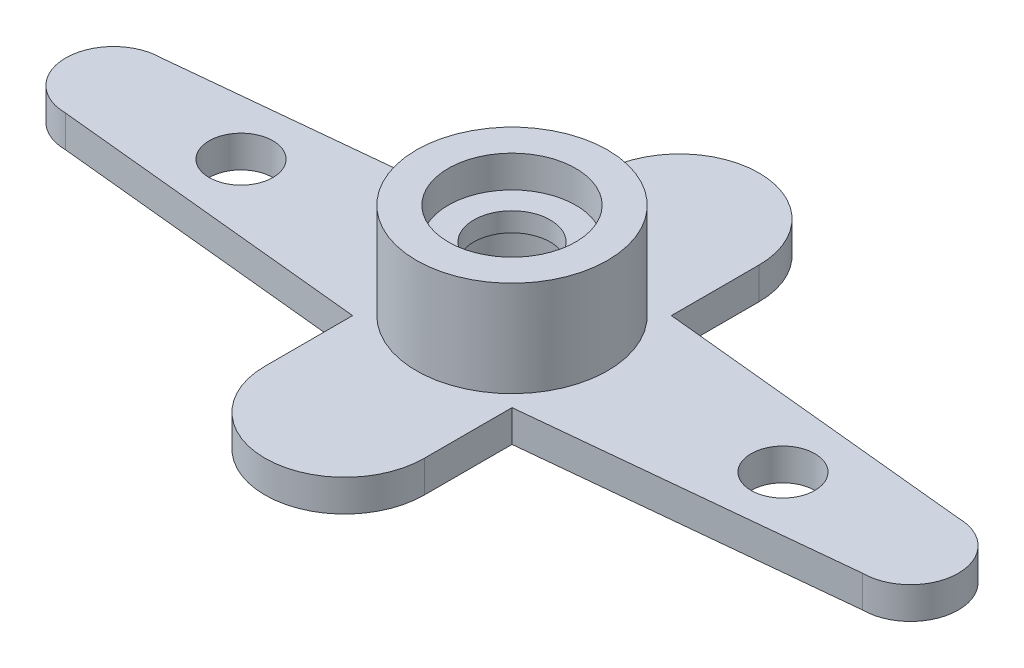
ISO-10303-21;
HEADER;
FILE_DESCRIPTION(('STEP AP214'),'2;1');
FILE_NAME('part.step','',(''),(''),'','','');
FILE_SCHEMA(('AUTOMOTIVE_DESIGN { 1 0 10303 214 1 1 1 1 }'));
ENDSEC;
DATA;
#1=APPLICATION_CONTEXT('core data for automotive mechanical design processes');
#2=APPLICATION_PROTOCOL_DEFINITION('international standard','automotive_design',2000,#1);
#3=PRODUCT_CONTEXT('',#1,'mechanical');
#4=PRODUCT('Part','Part','',(#3));
#5=PRODUCT_RELATED_PRODUCT_CATEGORY('part','',(#4));
#6=PRODUCT_DEFINITION_FORMATION('','',#4);
#7=PRODUCT_DEFINITION_CONTEXT('part definition',#1,'design');
#8=PRODUCT_DEFINITION('design','',#6,#7);
#9=PRODUCT_DEFINITION_SHAPE('','',#8);
#10=(LENGTH_UNIT() NAMED_UNIT(*) SI_UNIT(.MILLI.,.METRE.));
#11=(NAMED_UNIT(*) PLANE_ANGLE_UNIT() SI_UNIT($,.RADIAN.));
#12=(NAMED_UNIT(*) SI_UNIT($,.STERADIAN.) SOLID_ANGLE_UNIT());
#13=UNCERTAINTY_MEASURE_WITH_UNIT(LENGTH_MEASURE(1.E-05),#10,'distance_accuracy_value','');
#14=(GEOMETRIC_REPRESENTATION_CONTEXT(3) GLOBAL_UNCERTAINTY_ASSIGNED_CONTEXT((#13)) GLOBAL_UNIT_ASSIGNED_CONTEXT((#10,
#11,#12)) REPRESENTATION_CONTEXT('',''));
#15=CARTESIAN_POINT('',(0.,0.,0.));
#16=DIRECTION('',(0.,0.,1.));
#17=DIRECTION('',(1.,0.,0.));
#18=AXIS2_PLACEMENT_3D('',#15,#16,#17);
#19=CARTESIAN_POINT('',(0.,2.5,0.));
#20=DIRECTION('',(0.,-1.,0.));
#21=DIRECTION('',(0.,0.,-1.));
#22=AXIS2_PLACEMENT_3D('',#19,#20,#21);
#23=CYLINDRICAL_SURFACE('',#22,10.);
#24=CARTESIAN_POINT('',(0.,-2.5,0.));
#25=DIRECTION('',(0.,1.,0.));
#26=DIRECTION('',(0.,0.,1.));
#27=AXIS2_PLACEMENT_3D('',#24,#25,#26);
#28=CIRCLE('',#27,10.);
#29=CARTESIAN_POINT('',(0.,-2.5,10.));
#30=VERTEX_POINT('',#29);
#31=EDGE_CURVE('E163',#30,#30,#28,.T.);
#32=ORIENTED_EDGE('',*,*,#31,.F.);
#33=EDGE_LOOP('',(#32));
#34=FACE_BOUND('',#33,.T.);
#35=CARTESIAN_POINT('',(0.,9.5,0.));
#36=DIRECTION('',(0.,1.,0.));
#37=DIRECTION('',(0.,0.,1.));
#38=AXIS2_PLACEMENT_3D('',#35,#36,#37);
#39=CIRCLE('',#38,10.);
#40=CARTESIAN_POINT('',(0.,9.5,10.));
#41=VERTEX_POINT('',#40);
#42=EDGE_CURVE('E319',#41,#41,#39,.T.);
#43=ORIENTED_EDGE('',*,*,#42,.T.);
#44=EDGE_LOOP('',(#43));
#45=FACE_BOUND('',#44,.T.);
#46=ADVANCED_FACE('F36',(#34,#45),#23,.F.);
#47=CARTESIAN_POINT('',(62.5,2.5,0.));
#48=DIRECTION('',(0.,-1.,0.));
#49=DIRECTION('',(0.,0.,-1.));
#50=AXIS2_PLACEMENT_3D('',#47,#48,#49);
#51=PLANE('',#50);
#52=CARTESIAN_POINT('',(42.5,2.5,0.));
#53=DIRECTION('',(0.,1.,0.));
#54=DIRECTION('',(0.,0.,1.));
#55=AXIS2_PLACEMENT_3D('',#52,#53,#54);
#56=CIRCLE('',#55,5.);
#57=CARTESIAN_POINT('',(42.5,2.5,4.99999999999999));
#58=VERTEX_POINT('',#57);
#59=EDGE_CURVE('E322',#58,#58,#56,.T.);
#60=ORIENTED_EDGE('',*,*,#59,.F.);
#61=EDGE_LOOP('',(#60));
#62=FACE_BOUND('',#61,.T.);
#63=CARTESIAN_POINT('',(-42.5,2.5,0.));
#64=DIRECTION('',(0.,1.,0.));
#65=DIRECTION('',(0.,0.,1.));
#66=AXIS2_PLACEMENT_3D('',#63,#64,#65);
#67=CIRCLE('',#66,5.);
#68=CARTESIAN_POINT('',(-42.5,2.5,5.));
#69=VERTEX_POINT('',#68);
#70=EDGE_CURVE('E315',#69,#69,#67,.T.);
#71=ORIENTED_EDGE('',*,*,#70,.F.);
#72=EDGE_LOOP('',(#71));
#73=FACE_BOUND('',#72,.T.);
#74=DIRECTION('',(-0.995037190209989,0.,-0.099503719020999));
#75=VECTOR('',#74,1.);
#76=CARTESIAN_POINT('',(12.5,2.5,-12.5));
#77=LINE('',#76,#75);
#78=CARTESIAN_POINT('',(62.5,2.5,-7.5));
#79=VERTEX_POINT('',#78);
#80=CARTESIAN_POINT('',(12.5,2.5,-12.5));
#81=VERTEX_POINT('',#80);
#82=EDGE_CURVE('E182',#79,#81,#77,.T.);
#83=ORIENTED_EDGE('',*,*,#82,.T.);
#84=DIRECTION('',(0.,0.,-1.));
#85=VECTOR('',#84,1.);
#86=CARTESIAN_POINT('',(12.5,2.5,-12.5));
#87=LINE('',#86,#85);
#88=CARTESIAN_POINT('',(12.5,2.5,-26.25));
#89=VERTEX_POINT('',#88);
#90=EDGE_CURVE('E109',#81,#89,#87,.T.);
#91=ORIENTED_EDGE('',*,*,#90,.T.);
#92=CARTESIAN_POINT('',(0.,2.5,-26.25));
#93=DIRECTION('',(0.,1.,0.));
#94=DIRECTION('',(0.,0.,1.));
#95=AXIS2_PLACEMENT_3D('',#92,#93,#94);
#96=CIRCLE('',#95,12.5);
#97=CARTESIAN_POINT('',(-12.5,2.5,-26.25));
#98=VERTEX_POINT('',#97);
#99=EDGE_CURVE('E275',#89,#98,#96,.T.);
#100=ORIENTED_EDGE('',*,*,#99,.T.);
#101=DIRECTION('',(0.,0.,1.));
#102=VECTOR('',#101,1.);
#103=CARTESIAN_POINT('',(-12.5,2.5,-26.25));
#104=LINE('',#103,#102);
#105=CARTESIAN_POINT('',(-12.5,2.5,-12.5));
#106=VERTEX_POINT('',#105);
#107=EDGE_CURVE('E287',#98,#106,#104,.T.);
#108=ORIENTED_EDGE('',*,*,#107,.T.);
#109=DIRECTION('',(-0.995037190209989,0.,0.099503719020999));
#110=VECTOR('',#109,1.);
#111=CARTESIAN_POINT('',(-12.5,2.5,-12.5));
#112=LINE('',#111,#110);
#113=CARTESIAN_POINT('',(-62.5,2.5,-7.5));
#114=VERTEX_POINT('',#113);
#115=EDGE_CURVE('E284',#106,#114,#112,.T.);
#116=ORIENTED_EDGE('',*,*,#115,.T.);
#117=CARTESIAN_POINT('',(-62.5,2.5,0.));
#118=DIRECTION('',(0.,1.,0.));
#119=DIRECTION('',(0.,0.,-1.));
#120=AXIS2_PLACEMENT_3D('',#117,#118,#119);
#121=CIRCLE('',#120,7.5);
#122=CARTESIAN_POINT('',(-62.5,2.5,7.5));
#123=VERTEX_POINT('',#122);
#124=EDGE_CURVE('E286',#114,#123,#121,.T.);
#125=ORIENTED_EDGE('',*,*,#124,.T.);
#126=DIRECTION('',(0.995037190209989,0.,0.099503719020999));
#127=VECTOR('',#126,1.);
#128=CARTESIAN_POINT('',(-62.5,2.5,7.5));
#129=LINE('',#128,#127);
#130=CARTESIAN_POINT('',(-12.5,2.5,12.5));
#131=VERTEX_POINT('',#130);
#132=EDGE_CURVE('E289',#123,#131,#129,.T.);
#133=ORIENTED_EDGE('',*,*,#132,.T.);
#134=DIRECTION('',(0.,0.,1.));
#135=VECTOR('',#134,1.);
#136=CARTESIAN_POINT('',(-12.5,2.5,26.25));
#137=LINE('',#136,#135);
#138=CARTESIAN_POINT('',(-12.5,2.5,26.25));
#139=VERTEX_POINT('',#138);
#140=EDGE_CURVE('E295',#131,#139,#137,.T.);
#141=ORIENTED_EDGE('',*,*,#140,.T.);
#142=CARTESIAN_POINT('',(0.,2.5,26.25));
#143=DIRECTION('',(0.,1.,0.));
#144=DIRECTION('',(0.,0.,1.));
#145=AXIS2_PLACEMENT_3D('',#142,#143,#144);
#146=CIRCLE('',#145,12.5);
#147=CARTESIAN_POINT('',(12.5,2.5,26.25));
#148=VERTEX_POINT('',#147);
#149=EDGE_CURVE('E141',#139,#148,#146,.T.);
#150=ORIENTED_EDGE('',*,*,#149,.T.);
#151=DIRECTION('',(0.,0.,-1.));
#152=VECTOR('',#151,1.);
#153=CARTESIAN_POINT('',(12.5,2.5,12.5));
#154=LINE('',#153,#152);
#155=CARTESIAN_POINT('',(12.5,2.5,12.5));
#156=VERTEX_POINT('',#155);
#157=EDGE_CURVE('E134',#148,#156,#154,.T.);
#158=ORIENTED_EDGE('',*,*,#157,.T.);
#159=DIRECTION('',(0.995037190209989,0.,-0.099503719020999));
#160=VECTOR('',#159,1.);
#161=CARTESIAN_POINT('',(62.5,2.5,7.5));
#162=LINE('',#161,#160);
#163=CARTESIAN_POINT('',(62.5,2.5,7.5));
#164=VERTEX_POINT('',#163);
#165=EDGE_CURVE('E139',#156,#164,#162,.T.);
#166=ORIENTED_EDGE('',*,*,#165,.T.);
#167=CARTESIAN_POINT('',(62.5,2.5,0.));
#168=DIRECTION('',(0.,1.,0.));
#169=DIRECTION('',(0.,0.,-1.));
#170=AXIS2_PLACEMENT_3D('',#167,#168,#169);
#171=CIRCLE('',#170,7.5);
#172=EDGE_CURVE('E53',#164,#79,#171,.T.);
#173=ORIENTED_EDGE('',*,*,#172,.T.);
#174=EDGE_LOOP('',(#83,#91,#100,#108,#116,#125,#133,#141,#150,#158,#166,#173));
#175=FACE_BOUND('',#174,.T.);
#176=CARTESIAN_POINT('',(0.,2.5,0.));
#177=DIRECTION('',(0.,-1.,0.));
#178=DIRECTION('',(0.,0.,-1.));
#179=AXIS2_PLACEMENT_3D('',#176,#177,#178);
#180=CIRCLE('',#179,15.);
#181=CARTESIAN_POINT('',(0.,2.5,-15.));
#182=VERTEX_POINT('',#181);
#183=EDGE_CURVE('E45',#182,#182,#180,.F.);
#184=ORIENTED_EDGE('',*,*,#183,.F.);
#185=EDGE_LOOP('',(#184));
#186=FACE_BOUND('',#185,.T.);
#187=ADVANCED_FACE('F136',(#62,#73,#175,#186),#51,.F.);
#188=CARTESIAN_POINT('',(62.5,-2.5,0.));
#189=DIRECTION('',(0.,-1.,0.));
#190=DIRECTION('',(0.,0.,-1.));
#191=AXIS2_PLACEMENT_3D('',#188,#189,#190);
#192=PLANE('',#191);
#193=CARTESIAN_POINT('',(42.5,-2.5,0.));
#194=DIRECTION('',(0.,1.,0.));
#195=DIRECTION('',(0.,0.,1.));
#196=AXIS2_PLACEMENT_3D('',#193,#194,#195);
#197=CIRCLE('',#196,5.);
#198=CARTESIAN_POINT('',(42.5,-2.5,4.99999999999999));
#199=VERTEX_POINT('',#198);
#200=EDGE_CURVE('E314',#199,#199,#197,.T.);
#201=ORIENTED_EDGE('',*,*,#200,.T.);
#202=EDGE_LOOP('',(#201));
#203=FACE_BOUND('',#202,.T.);
#204=CARTESIAN_POINT('',(-42.5,-2.5,0.));
#205=DIRECTION('',(0.,1.,0.));
#206=DIRECTION('',(0.,0.,1.));
#207=AXIS2_PLACEMENT_3D('',#204,#205,#206);
#208=CIRCLE('',#207,5.);
#209=CARTESIAN_POINT('',(-42.5,-2.5,5.));
#210=VERTEX_POINT('',#209);
#211=EDGE_CURVE('E318',#210,#210,#208,.T.);
#212=ORIENTED_EDGE('',*,*,#211,.T.);
#213=EDGE_LOOP('',(#212));
#214=FACE_BOUND('',#213,.T.);
#215=DIRECTION('',(-0.995037190209989,0.,-0.099503719020999));
#216=VECTOR('',#215,1.);
#217=CARTESIAN_POINT('',(12.5,-2.5,-12.5));
#218=LINE('',#217,#216);
#219=CARTESIAN_POINT('',(62.5,-2.5,-7.5));
#220=VERTEX_POINT('',#219);
#221=CARTESIAN_POINT('',(12.5,-2.5,-12.5));
#222=VERTEX_POINT('',#221);
#223=EDGE_CURVE('E159',#220,#222,#218,.T.);
#224=ORIENTED_EDGE('',*,*,#223,.F.);
#225=CARTESIAN_POINT('',(62.5,-2.5,0.));
#226=DIRECTION('',(0.,1.,0.));
#227=DIRECTION('',(0.,0.,-1.));
#228=AXIS2_PLACEMENT_3D('',#225,#226,#227);
#229=CIRCLE('',#228,7.5);
#230=CARTESIAN_POINT('',(62.5,-2.5,7.5));
#231=VERTEX_POINT('',#230);
#232=EDGE_CURVE('E100',#231,#220,#229,.T.);
#233=ORIENTED_EDGE('',*,*,#232,.F.);
#234=DIRECTION('',(0.995037190209989,0.,-0.099503719020999));
#235=VECTOR('',#234,1.);
#236=CARTESIAN_POINT('',(62.5,-2.5,7.5));
#237=LINE('',#236,#235);
#238=CARTESIAN_POINT('',(12.5,-2.5,12.5));
#239=VERTEX_POINT('',#238);
#240=EDGE_CURVE('E94',#239,#231,#237,.T.);
#241=ORIENTED_EDGE('',*,*,#240,.F.);
#242=DIRECTION('',(0.,0.,-1.));
#243=VECTOR('',#242,1.);
#244=CARTESIAN_POINT('',(12.5,-2.5,12.5));
#245=LINE('',#244,#243);
#246=CARTESIAN_POINT('',(12.5,-2.5,26.25));
#247=VERTEX_POINT('',#246);
#248=EDGE_CURVE('E149',#247,#239,#245,.T.);
#249=ORIENTED_EDGE('',*,*,#248,.F.);
#250=CARTESIAN_POINT('',(0.,-2.5,26.25));
#251=DIRECTION('',(0.,1.,0.));
#252=DIRECTION('',(0.,0.,1.));
#253=AXIS2_PLACEMENT_3D('',#250,#251,#252);
#254=CIRCLE('',#253,12.5);
#255=CARTESIAN_POINT('',(-12.5,-2.5,26.25));
#256=VERTEX_POINT('',#255);
#257=EDGE_CURVE('E177',#256,#247,#254,.T.);
#258=ORIENTED_EDGE('',*,*,#257,.F.);
#259=DIRECTION('',(0.,0.,1.));
#260=VECTOR('',#259,1.);
#261=CARTESIAN_POINT('',(-12.5,-2.5,26.25));
#262=LINE('',#261,#260);
#263=CARTESIAN_POINT('',(-12.5,-2.5,12.5));
#264=VERTEX_POINT('',#263);
#265=EDGE_CURVE('E175',#264,#256,#262,.T.);
#266=ORIENTED_EDGE('',*,*,#265,.F.);
#267=DIRECTION('',(0.995037190209989,0.,0.099503719020999));
#268=VECTOR('',#267,1.);
#269=CARTESIAN_POINT('',(-62.5,-2.5,7.5));
#270=LINE('',#269,#268);
#271=CARTESIAN_POINT('',(-62.5,-2.5,7.5));
#272=VERTEX_POINT('',#271);
#273=EDGE_CURVE('E173',#272,#264,#270,.T.);
#274=ORIENTED_EDGE('',*,*,#273,.F.);
#275=CARTESIAN_POINT('',(-62.5,-2.5,0.));
#276=DIRECTION('',(0.,1.,0.));
#277=DIRECTION('',(0.,0.,-1.));
#278=AXIS2_PLACEMENT_3D('',#275,#276,#277);
#279=CIRCLE('',#278,7.5);
#280=CARTESIAN_POINT('',(-62.5,-2.5,-7.5));
#281=VERTEX_POINT('',#280);
#282=EDGE_CURVE('E171',#281,#272,#279,.T.);
#283=ORIENTED_EDGE('',*,*,#282,.F.);
#284=DIRECTION('',(-0.995037190209989,0.,0.099503719020999));
#285=VECTOR('',#284,1.);
#286=CARTESIAN_POINT('',(-12.5,-2.5,-12.5));
#287=LINE('',#286,#285);
#288=CARTESIAN_POINT('',(-12.5,-2.5,-12.5));
#289=VERTEX_POINT('',#288);
#290=EDGE_CURVE('E169',#289,#281,#287,.T.);
#291=ORIENTED_EDGE('',*,*,#290,.F.);
#292=DIRECTION('',(0.,0.,1.));
#293=VECTOR('',#292,1.);
#294=CARTESIAN_POINT('',(-12.5,-2.5,-26.25));
#295=LINE('',#294,#293);
#296=CARTESIAN_POINT('',(-12.5,-2.5,-26.25));
#297=VERTEX_POINT('',#296);
#298=EDGE_CURVE('E167',#297,#289,#295,.T.);
#299=ORIENTED_EDGE('',*,*,#298,.F.);
#300=CARTESIAN_POINT('',(0.,-2.5,-26.25));
#301=DIRECTION('',(0.,1.,0.));
#302=DIRECTION('',(0.,0.,1.));
#303=AXIS2_PLACEMENT_3D('',#300,#301,#302);
#304=CIRCLE('',#303,12.5);
#305=CARTESIAN_POINT('',(12.5,-2.5,-26.25));
#306=VERTEX_POINT('',#305);
#307=EDGE_CURVE('E165',#306,#297,#304,.T.);
#308=ORIENTED_EDGE('',*,*,#307,.F.);
#309=DIRECTION('',(0.,0.,-1.));
#310=VECTOR('',#309,1.);
#311=CARTESIAN_POINT('',(12.5,-2.5,-12.5));
#312=LINE('',#311,#310);
#313=EDGE_CURVE('E162',#222,#306,#312,.T.);
#314=ORIENTED_EDGE('',*,*,#313,.F.);
#315=EDGE_LOOP('',(#224,#233,#241,#249,#258,#266,#274,#283,#291,#299,#308,#314));
#316=FACE_BOUND('',#315,.T.);
#317=ORIENTED_EDGE('',*,*,#31,.T.);
#318=EDGE_LOOP('',(#317));
#319=FACE_BOUND('',#318,.T.);
#320=ADVANCED_FACE('F213',(#203,#214,#316,#319),#192,.T.);
#321=CARTESIAN_POINT('',(12.5,2.5,-12.5));
#322=DIRECTION('',(-0.099503719020999,0.,0.995037190209989));
#323=DIRECTION('',(0.995037190209989,0.,0.0995037190209991));
#324=AXIS2_PLACEMENT_3D('',#321,#322,#323);
#325=PLANE('',#324);
#326=ORIENTED_EDGE('',*,*,#223,.T.);
#327=DIRECTION('',(0.,-1.,0.));
#328=VECTOR('',#327,1.);
#329=CARTESIAN_POINT('',(12.5,2.5,-12.5));
#330=LINE('',#329,#328);
#331=EDGE_CURVE('E207',#81,#222,#330,.T.);
#332=ORIENTED_EDGE('',*,*,#331,.F.);
#333=ORIENTED_EDGE('',*,*,#82,.F.);
#334=DIRECTION('',(0.,-1.,0.));
#335=VECTOR('',#334,1.);
#336=CARTESIAN_POINT('',(62.5,2.5,-7.5));
#337=LINE('',#336,#335);
#338=EDGE_CURVE('E155',#79,#220,#337,.T.);
#339=ORIENTED_EDGE('',*,*,#338,.T.);
#340=EDGE_LOOP('',(#326,#332,#333,#339));
#341=FACE_BOUND('',#340,.T.);
#342=ADVANCED_FACE('F38',(#341),#325,.F.);
#343=CARTESIAN_POINT('',(12.5,2.5,-12.5));
#344=DIRECTION('',(-1.,0.,0.));
#345=DIRECTION('',(0.,0.,1.));
#346=AXIS2_PLACEMENT_3D('',#343,#344,#345);
#347=PLANE('',#346);
#348=ORIENTED_EDGE('',*,*,#313,.T.);
#349=DIRECTION('',(0.,-1.,0.));
#350=VECTOR('',#349,1.);
#351=CARTESIAN_POINT('',(12.5,2.5,-26.25));
#352=LINE('',#351,#350);
#353=EDGE_CURVE('E204',#89,#306,#352,.T.);
#354=ORIENTED_EDGE('',*,*,#353,.F.);
#355=ORIENTED_EDGE('',*,*,#90,.F.);
#356=ORIENTED_EDGE('',*,*,#331,.T.);
#357=EDGE_LOOP('',(#348,#354,#355,#356));
#358=FACE_BOUND('',#357,.T.);
#359=ADVANCED_FACE('F262',(#358),#347,.F.);
#360=CARTESIAN_POINT('',(0.,2.5,-26.25));
#361=DIRECTION('',(0.,-1.,0.));
#362=DIRECTION('',(0.,0.,-1.));
#363=AXIS2_PLACEMENT_3D('',#360,#361,#362);
#364=CYLINDRICAL_SURFACE('',#363,12.5);
#365=ORIENTED_EDGE('',*,*,#307,.T.);
#366=DIRECTION('',(0.,-1.,0.));
#367=VECTOR('',#366,1.);
#368=CARTESIAN_POINT('',(-12.5,2.5,-26.25));
#369=LINE('',#368,#367);
#370=EDGE_CURVE('E201',#98,#297,#369,.T.);
#371=ORIENTED_EDGE('',*,*,#370,.F.);
#372=ORIENTED_EDGE('',*,*,#99,.F.);
#373=ORIENTED_EDGE('',*,*,#353,.T.);
#374=EDGE_LOOP('',(#365,#371,#372,#373));
#375=FACE_BOUND('',#374,.T.);
#376=ADVANCED_FACE('F259',(#375),#364,.T.);
#377=CARTESIAN_POINT('',(-12.5,2.5,-26.25));
#378=DIRECTION('',(1.,0.,0.));
#379=DIRECTION('',(0.,0.,-1.));
#380=AXIS2_PLACEMENT_3D('',#377,#378,#379);
#381=PLANE('',#380);
#382=ORIENTED_EDGE('',*,*,#298,.T.);
#383=DIRECTION('',(0.,-1.,0.));
#384=VECTOR('',#383,1.);
#385=CARTESIAN_POINT('',(-12.5,2.5,-12.5));
#386=LINE('',#385,#384);
#387=EDGE_CURVE('E198',#106,#289,#386,.T.);
#388=ORIENTED_EDGE('',*,*,#387,.F.);
#389=ORIENTED_EDGE('',*,*,#107,.F.);
#390=ORIENTED_EDGE('',*,*,#370,.T.);
#391=EDGE_LOOP('',(#382,#388,#389,#390));
#392=FACE_BOUND('',#391,.T.);
#393=ADVANCED_FACE('F255',(#392),#381,.F.);
#394=CARTESIAN_POINT('',(-12.5,2.5,-12.5));
#395=DIRECTION('',(0.099503719020999,0.,0.995037190209989));
#396=DIRECTION('',(0.995037190209989,0.,-0.099503719020999));
#397=AXIS2_PLACEMENT_3D('',#394,#395,#396);
#398=PLANE('',#397);
#399=ORIENTED_EDGE('',*,*,#290,.T.);
#400=DIRECTION('',(0.,-1.,0.));
#401=VECTOR('',#400,1.);
#402=CARTESIAN_POINT('',(-62.5,2.5,-7.5));
#403=LINE('',#402,#401);
#404=EDGE_CURVE('E195',#114,#281,#403,.T.);
#405=ORIENTED_EDGE('',*,*,#404,.F.);
#406=ORIENTED_EDGE('',*,*,#115,.F.);
#407=ORIENTED_EDGE('',*,*,#387,.T.);
#408=EDGE_LOOP('',(#399,#405,#406,#407));
#409=FACE_BOUND('',#408,.T.);
#410=ADVANCED_FACE('F251',(#409),#398,.F.);
#411=CARTESIAN_POINT('',(-62.5,2.5,0.));
#412=DIRECTION('',(0.,-1.,0.));
#413=DIRECTION('',(0.,0.,-1.));
#414=AXIS2_PLACEMENT_3D('',#411,#412,#413);
#415=CYLINDRICAL_SURFACE('',#414,7.5);
#416=ORIENTED_EDGE('',*,*,#282,.T.);
#417=DIRECTION('',(0.,-1.,0.));
#418=VECTOR('',#417,1.);
#419=CARTESIAN_POINT('',(-62.5,2.5,7.5));
#420=LINE('',#419,#418);
#421=EDGE_CURVE('E192',#123,#272,#420,.T.);
#422=ORIENTED_EDGE('',*,*,#421,.F.);
#423=ORIENTED_EDGE('',*,*,#124,.F.);
#424=ORIENTED_EDGE('',*,*,#404,.T.);
#425=EDGE_LOOP('',(#416,#422,#423,#424));
#426=FACE_BOUND('',#425,.T.);
#427=ADVANCED_FACE('F247',(#426),#415,.T.);
#428=CARTESIAN_POINT('',(-62.5,2.5,7.5));
#429=DIRECTION('',(0.099503719020999,0.,-0.995037190209989));
#430=DIRECTION('',(-0.995037190209989,0.,-0.099503719020999));
#431=AXIS2_PLACEMENT_3D('',#428,#429,#430);
#432=PLANE('',#431);
#433=ORIENTED_EDGE('',*,*,#273,.T.);
#434=DIRECTION('',(0.,-1.,0.));
#435=VECTOR('',#434,1.);
#436=CARTESIAN_POINT('',(-12.5,2.5,12.5));
#437=LINE('',#436,#435);
#438=EDGE_CURVE('E189',#131,#264,#437,.T.);
#439=ORIENTED_EDGE('',*,*,#438,.F.);
#440=ORIENTED_EDGE('',*,*,#132,.F.);
#441=ORIENTED_EDGE('',*,*,#421,.T.);
#442=EDGE_LOOP('',(#433,#439,#440,#441));
#443=FACE_BOUND('',#442,.T.);
#444=ADVANCED_FACE('F243',(#443),#432,.F.);
#445=CARTESIAN_POINT('',(-12.5,2.5,26.25));
#446=DIRECTION('',(1.,0.,0.));
#447=DIRECTION('',(0.,0.,-1.));
#448=AXIS2_PLACEMENT_3D('',#445,#446,#447);
#449=PLANE('',#448);
#450=ORIENTED_EDGE('',*,*,#265,.T.);
#451=DIRECTION('',(0.,-1.,0.));
#452=VECTOR('',#451,1.);
#453=CARTESIAN_POINT('',(-12.5,2.5,26.25));
#454=LINE('',#453,#452);
#455=EDGE_CURVE('E186',#139,#256,#454,.T.);
#456=ORIENTED_EDGE('',*,*,#455,.F.);
#457=ORIENTED_EDGE('',*,*,#140,.F.);
#458=ORIENTED_EDGE('',*,*,#438,.T.);
#459=EDGE_LOOP('',(#450,#456,#457,#458));
#460=FACE_BOUND('',#459,.T.);
#461=ADVANCED_FACE('F239',(#460),#449,.F.);
#462=CARTESIAN_POINT('',(0.,2.5,26.25));
#463=DIRECTION('',(0.,-1.,0.));
#464=DIRECTION('',(0.,0.,-1.));
#465=AXIS2_PLACEMENT_3D('',#462,#463,#464);
#466=CYLINDRICAL_SURFACE('',#465,12.5);
#467=ORIENTED_EDGE('',*,*,#257,.T.);
#468=DIRECTION('',(0.,-1.,0.));
#469=VECTOR('',#468,1.);
#470=CARTESIAN_POINT('',(12.5,2.5,26.25));
#471=LINE('',#470,#469);
#472=EDGE_CURVE('E150',#148,#247,#471,.T.);
#473=ORIENTED_EDGE('',*,*,#472,.F.);
#474=ORIENTED_EDGE('',*,*,#149,.F.);
#475=ORIENTED_EDGE('',*,*,#455,.T.);
#476=EDGE_LOOP('',(#467,#473,#474,#475));
#477=FACE_BOUND('',#476,.T.);
#478=ADVANCED_FACE('F236',(#477),#466,.T.);
#479=CARTESIAN_POINT('',(12.5,2.5,12.5));
#480=DIRECTION('',(-1.,0.,0.));
#481=DIRECTION('',(0.,0.,1.));
#482=AXIS2_PLACEMENT_3D('',#479,#480,#481);
#483=PLANE('',#482);
#484=ORIENTED_EDGE('',*,*,#248,.T.);
#485=DIRECTION('',(0.,-1.,0.));
#486=VECTOR('',#485,1.);
#487=CARTESIAN_POINT('',(12.5,2.5,12.5));
#488=LINE('',#487,#486);
#489=EDGE_CURVE('E146',#156,#239,#488,.T.);
#490=ORIENTED_EDGE('',*,*,#489,.F.);
#491=ORIENTED_EDGE('',*,*,#157,.F.);
#492=ORIENTED_EDGE('',*,*,#472,.T.);
#493=EDGE_LOOP('',(#484,#490,#491,#492));
#494=FACE_BOUND('',#493,.T.);
#495=ADVANCED_FACE('F147',(#494),#483,.F.);
#496=CARTESIAN_POINT('',(62.5,2.5,7.5));
#497=DIRECTION('',(-0.099503719020999,0.,-0.995037190209989));
#498=DIRECTION('',(-0.995037190209989,0.,0.099503719020999));
#499=AXIS2_PLACEMENT_3D('',#496,#497,#498);
#500=PLANE('',#499);
#501=ORIENTED_EDGE('',*,*,#240,.T.);
#502=DIRECTION('',(0.,-1.,0.));
#503=VECTOR('',#502,1.);
#504=CARTESIAN_POINT('',(62.5,2.5,7.5));
#505=LINE('',#504,#503);
#506=EDGE_CURVE('E151',#164,#231,#505,.T.);
#507=ORIENTED_EDGE('',*,*,#506,.F.);
#508=ORIENTED_EDGE('',*,*,#165,.F.);
#509=ORIENTED_EDGE('',*,*,#489,.T.);
#510=EDGE_LOOP('',(#501,#507,#508,#509));
#511=FACE_BOUND('',#510,.T.);
#512=ADVANCED_FACE('F153',(#511),#500,.F.);
#513=CARTESIAN_POINT('',(62.5,2.5,0.));
#514=DIRECTION('',(0.,-1.,0.));
#515=DIRECTION('',(0.,0.,-1.));
#516=AXIS2_PLACEMENT_3D('',#513,#514,#515);
#517=CYLINDRICAL_SURFACE('',#516,7.5);
#518=ORIENTED_EDGE('',*,*,#232,.T.);
#519=ORIENTED_EDGE('',*,*,#338,.F.);
#520=ORIENTED_EDGE('',*,*,#172,.F.);
#521=ORIENTED_EDGE('',*,*,#506,.T.);
#522=EDGE_LOOP('',(#518,#519,#520,#521));
#523=FACE_BOUND('',#522,.T.);
#524=ADVANCED_FACE('F229',(#523),#517,.T.);
#525=CARTESIAN_POINT('',(0.,12.5,0.));
#526=DIRECTION('',(0.,1.,0.));
#527=DIRECTION('',(0.,0.,1.));
#528=AXIS2_PLACEMENT_3D('',#525,#526,#527);
#529=CIRCLE('',#528,10.);
#530=CARTESIAN_POINT('',(0.,12.5,10.));
#531=VERTEX_POINT('',#530);
#532=EDGE_CURVE('E11',#531,#531,#529,.T.);
#533=ORIENTED_EDGE('',*,*,#532,.F.);
#534=EDGE_LOOP('',(#533));
#535=FACE_BOUND('',#534,.T.);
#536=CARTESIAN_POINT('',(0.,17.5,0.));
#537=DIRECTION('',(0.,1.,0.));
#538=DIRECTION('',(0.,0.,1.));
#539=AXIS2_PLACEMENT_3D('',#536,#537,#538);
#540=CIRCLE('',#539,10.);
#541=CARTESIAN_POINT('',(0.,17.5,10.));
#542=VERTEX_POINT('',#541);
#543=EDGE_CURVE('E311',#542,#542,#540,.T.);
#544=ORIENTED_EDGE('',*,*,#543,.T.);
#545=EDGE_LOOP('',(#544));
#546=FACE_BOUND('',#545,.T.);
#547=ADVANCED_FACE('F224',(#535,#546),#23,.F.);
#548=CARTESIAN_POINT('',(0.,17.5,0.));
#549=DIRECTION('',(0.,1.,0.));
#550=DIRECTION('',(0.,0.,1.));
#551=AXIS2_PLACEMENT_3D('',#548,#549,#550);
#552=PLANE('',#551);
#553=CARTESIAN_POINT('',(0.,17.5,0.));
#554=DIRECTION('',(0.,1.,0.));
#555=DIRECTION('',(0.,0.,1.));
#556=AXIS2_PLACEMENT_3D('',#553,#554,#555);
#557=CIRCLE('',#556,15.);
#558=CARTESIAN_POINT('',(0.,17.5,15.));
#559=VERTEX_POINT('',#558);
#560=EDGE_CURVE('E308',#559,#559,#557,.T.);
#561=ORIENTED_EDGE('',*,*,#560,.T.);
#562=EDGE_LOOP('',(#561));
#563=FACE_BOUND('',#562,.T.);
#564=ORIENTED_EDGE('',*,*,#543,.F.);
#565=EDGE_LOOP('',(#564));
#566=FACE_BOUND('',#565,.T.);
#567=ADVANCED_FACE('F359',(#563,#566),#552,.T.);
#568=CARTESIAN_POINT('',(0.,17.5,0.));
#569=DIRECTION('',(0.,-1.,0.));
#570=DIRECTION('',(0.,0.,-1.));
#571=AXIS2_PLACEMENT_3D('',#568,#569,#570);
#572=CYLINDRICAL_SURFACE('',#571,15.);
#573=ORIENTED_EDGE('',*,*,#560,.F.);
#574=EDGE_LOOP('',(#573));
#575=FACE_BOUND('',#574,.T.);
#576=ORIENTED_EDGE('',*,*,#183,.T.);
#577=EDGE_LOOP('',(#576));
#578=FACE_BOUND('',#577,.T.);
#579=ADVANCED_FACE('F211',(#575,#578),#572,.T.);
#580=CARTESIAN_POINT('',(-42.5,-2.5,0.));
#581=DIRECTION('',(0.,1.,0.));
#582=DIRECTION('',(0.,0.,1.));
#583=AXIS2_PLACEMENT_3D('',#580,#581,#582);
#584=CYLINDRICAL_SURFACE('',#583,5.);
#585=ORIENTED_EDGE('',*,*,#211,.F.);
#586=EDGE_LOOP('',(#585));
#587=FACE_BOUND('',#586,.T.);
#588=ORIENTED_EDGE('',*,*,#70,.T.);
#589=EDGE_LOOP('',(#588));
#590=FACE_BOUND('',#589,.T.);
#591=ADVANCED_FACE('F351',(#587,#590),#584,.F.);
#592=CARTESIAN_POINT('',(42.5,-2.5,0.));
#593=DIRECTION('',(0.,1.,0.));
#594=DIRECTION('',(0.,0.,1.));
#595=AXIS2_PLACEMENT_3D('',#592,#593,#594);
#596=CYLINDRICAL_SURFACE('',#595,5.);
#597=ORIENTED_EDGE('',*,*,#200,.F.);
#598=EDGE_LOOP('',(#597));
#599=FACE_BOUND('',#598,.T.);
#600=ORIENTED_EDGE('',*,*,#59,.T.);
#601=EDGE_LOOP('',(#600));
#602=FACE_BOUND('',#601,.T.);
#603=ADVANCED_FACE('F342',(#599,#602),#596,.F.);
#604=CARTESIAN_POINT('',(0.,12.5,0.));
#605=DIRECTION('',(0.,1.,0.));
#606=DIRECTION('',(0.,0.,1.));
#607=AXIS2_PLACEMENT_3D('',#604,#605,#606);
#608=PLANE('',#607);
#609=ORIENTED_EDGE('',*,*,#532,.T.);
#610=EDGE_LOOP('',(#609));
#611=FACE_BOUND('',#610,.T.);
#612=CARTESIAN_POINT('',(0.,12.5,0.));
#613=DIRECTION('',(0.,1.,0.));
#614=DIRECTION('',(0.,0.,1.));
#615=AXIS2_PLACEMENT_3D('',#612,#613,#614);
#616=CIRCLE('',#615,6.);
#617=CARTESIAN_POINT('',(0.,12.5,6.));
#618=VERTEX_POINT('',#617);
#619=EDGE_CURVE('E329',#618,#618,#616,.T.);
#620=ORIENTED_EDGE('',*,*,#619,.F.);
#621=EDGE_LOOP('',(#620));
#622=FACE_BOUND('',#621,.T.);
#623=ADVANCED_FACE('F339',(#611,#622),#608,.T.);
#624=CARTESIAN_POINT('',(0.,9.5,0.));
#625=DIRECTION('',(0.,1.,0.));
#626=DIRECTION('',(0.,0.,1.));
#627=AXIS2_PLACEMENT_3D('',#624,#625,#626);
#628=PLANE('',#627);
#629=ORIENTED_EDGE('',*,*,#42,.F.);
#630=EDGE_LOOP('',(#629));
#631=FACE_BOUND('',#630,.T.);
#632=CARTESIAN_POINT('',(0.,9.5,0.));
#633=DIRECTION('',(0.,1.,0.));
#634=DIRECTION('',(0.,0.,1.));
#635=AXIS2_PLACEMENT_3D('',#632,#633,#634);
#636=CIRCLE('',#635,6.);
#637=CARTESIAN_POINT('',(0.,9.5,6.));
#638=VERTEX_POINT('',#637);
#639=EDGE_CURVE('E330',#638,#638,#636,.T.);
#640=ORIENTED_EDGE('',*,*,#639,.T.);
#641=EDGE_LOOP('',(#640));
#642=FACE_BOUND('',#641,.T.);
#643=ADVANCED_FACE('F341',(#631,#642),#628,.F.);
#644=CARTESIAN_POINT('',(0.,12.5,0.));
#645=DIRECTION('',(0.,-1.,0.));
#646=DIRECTION('',(0.,0.,-1.));
#647=AXIS2_PLACEMENT_3D('',#644,#645,#646);
#648=CYLINDRICAL_SURFACE('',#647,6.);
#649=ORIENTED_EDGE('',*,*,#619,.T.);
#650=EDGE_LOOP('',(#649));
#651=FACE_BOUND('',#650,.T.);
#652=ORIENTED_EDGE('',*,*,#639,.F.);
#653=EDGE_LOOP('',(#652));
#654=FACE_BOUND('',#653,.T.);
#655=ADVANCED_FACE('F336',(#651,#654),#648,.F.);
#656=CLOSED_SHELL('',(#46,#187,#320,#342,#359,#376,#393,#410,#427,#444,#461,#478,#495,#512,#524,
#547,#567,#579,#591,#603,#623,#643,#655));
#657=MANIFOLD_SOLID_BREP('B2',#656);
#658=ADVANCED_BREP_SHAPE_REPRESENTATION('',(#18,#657),#14);
#659=SHAPE_DEFINITION_REPRESENTATION(#9,#658);
ENDSEC;
END-ISO-10303-21;
